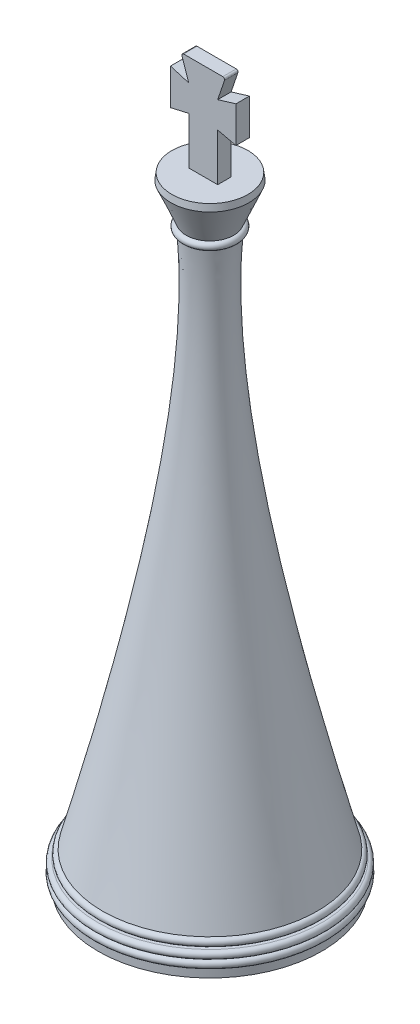
ISO-10303-21;
HEADER;
FILE_DESCRIPTION(('STEP AP214'),'2;1');
FILE_NAME('part.step','',(''),(''),'','','');
FILE_SCHEMA(('AUTOMOTIVE_DESIGN { 1 0 10303 214 1 1 1 1 }'));
ENDSEC;
DATA;
#1=APPLICATION_CONTEXT('core data for automotive mechanical design processes');
#2=APPLICATION_PROTOCOL_DEFINITION('international standard','automotive_design',2000,#1);
#3=PRODUCT_CONTEXT('',#1,'mechanical');
#4=PRODUCT('Part','Part','',(#3));
#5=PRODUCT_RELATED_PRODUCT_CATEGORY('part','',(#4));
#6=PRODUCT_DEFINITION_FORMATION('','',#4);
#7=PRODUCT_DEFINITION_CONTEXT('part definition',#1,'design');
#8=PRODUCT_DEFINITION('design','',#6,#7);
#9=PRODUCT_DEFINITION_SHAPE('','',#8);
#10=(LENGTH_UNIT() NAMED_UNIT(*) SI_UNIT(.MILLI.,.METRE.));
#11=(NAMED_UNIT(*) PLANE_ANGLE_UNIT() SI_UNIT($,.RADIAN.));
#12=(NAMED_UNIT(*) SI_UNIT($,.STERADIAN.) SOLID_ANGLE_UNIT());
#13=UNCERTAINTY_MEASURE_WITH_UNIT(LENGTH_MEASURE(1.E-05),#10,'distance_accuracy_value','');
#14=(GEOMETRIC_REPRESENTATION_CONTEXT(3) GLOBAL_UNCERTAINTY_ASSIGNED_CONTEXT((#13)) GLOBAL_UNIT_ASSIGNED_CONTEXT((#10,
#11,#12)) REPRESENTATION_CONTEXT('',''));
#15=CARTESIAN_POINT('',(0.,0.,0.));
#16=DIRECTION('',(0.,0.,1.));
#17=DIRECTION('',(1.,0.,0.));
#18=AXIS2_PLACEMENT_3D('',#15,#16,#17);
#19=CARTESIAN_POINT('',(0.,69.0986466795148,0.));
#20=DIRECTION('',(0.,1.,0.));
#21=DIRECTION('',(-1.,0.,0.));
#22=AXIS2_PLACEMENT_3D('',#19,#20,#21);
#23=PLANE('',#22);
#24=CARTESIAN_POINT('',(0.,69.0986466795148,0.));
#25=DIRECTION('',(0.,1.,0.));
#26=DIRECTION('',(-1.,0.,0.));
#27=AXIS2_PLACEMENT_3D('',#24,#25,#26);
#28=CIRCLE('',#27,4.25282971060416);
#29=CARTESIAN_POINT('',(-4.25282971060424,69.0986466795148,0.));
#30=VERTEX_POINT('',#29);
#31=EDGE_CURVE('E335',#30,#30,#28,.T.);
#32=ORIENTED_EDGE('',*,*,#31,.T.);
#33=EDGE_LOOP('',(#32));
#34=FACE_BOUND('',#33,.T.);
#35=DIRECTION('',(0.,0.,1.));
#36=VECTOR('',#35,1.);
#37=CARTESIAN_POINT('',(-1.61569162551264,69.0986466795148,-0.75));
#38=LINE('',#37,#36);
#39=CARTESIAN_POINT('',(-1.61569162551264,69.0986466795148,-0.75));
#40=VERTEX_POINT('',#39);
#41=CARTESIAN_POINT('',(-1.61569162551264,69.0986466795148,0.75));
#42=VERTEX_POINT('',#41);
#43=EDGE_CURVE('E170',#40,#42,#38,.T.);
#44=ORIENTED_EDGE('',*,*,#43,.F.);
#45=DIRECTION('',(1.,0.,0.));
#46=VECTOR('',#45,1.);
#47=CARTESIAN_POINT('',(0.,69.0986466795148,-0.75));
#48=LINE('',#47,#46);
#49=CARTESIAN_POINT('',(1.61569162551264,69.0986466795148,-0.75));
#50=VERTEX_POINT('',#49);
#51=EDGE_CURVE('E155',#40,#50,#48,.T.);
#52=ORIENTED_EDGE('',*,*,#51,.T.);
#53=DIRECTION('',(0.,0.,-1.));
#54=VECTOR('',#53,1.);
#55=CARTESIAN_POINT('',(1.61569162551264,69.0986466795148,0.75));
#56=LINE('',#55,#54);
#57=CARTESIAN_POINT('',(1.61569162551264,69.0986466795148,0.75));
#58=VERTEX_POINT('',#57);
#59=EDGE_CURVE('E332',#58,#50,#56,.T.);
#60=ORIENTED_EDGE('',*,*,#59,.F.);
#61=DIRECTION('',(1.,0.,0.));
#62=VECTOR('',#61,1.);
#63=CARTESIAN_POINT('',(0.,69.0986466795148,0.75));
#64=LINE('',#63,#62);
#65=EDGE_CURVE('E244',#42,#58,#64,.T.);
#66=ORIENTED_EDGE('',*,*,#65,.F.);
#67=EDGE_LOOP('',(#44,#52,#60,#66));
#68=FACE_BOUND('',#67,.T.);
#69=ADVANCED_FACE('F43',(#34,#68),#23,.T.);
#70=CARTESIAN_POINT('',(0.,1.,0.));
#71=DIRECTION('',(0.,-1.,0.));
#72=DIRECTION('',(0.,0.,-1.));
#73=AXIS2_PLACEMENT_3D('',#70,#71,#72);
#74=CYLINDRICAL_SURFACE('',#73,12.5);
#75=CARTESIAN_POINT('',(0.,1.,0.));
#76=DIRECTION('',(0.,1.,0.));
#77=DIRECTION('',(0.,0.,1.));
#78=AXIS2_PLACEMENT_3D('',#75,#76,#77);
#79=CIRCLE('',#78,12.5);
#80=CARTESIAN_POINT('',(0.,1.,12.5));
#81=VERTEX_POINT('',#80);
#82=EDGE_CURVE('E446',#81,#81,#79,.T.);
#83=ORIENTED_EDGE('',*,*,#82,.F.);
#84=EDGE_LOOP('',(#83));
#85=FACE_BOUND('',#84,.T.);
#86=CARTESIAN_POINT('',(0.,0.,0.));
#87=DIRECTION('',(0.,1.,0.));
#88=DIRECTION('',(0.,0.,1.));
#89=AXIS2_PLACEMENT_3D('',#86,#87,#88);
#90=CIRCLE('',#89,12.5);
#91=CARTESIAN_POINT('',(0.,0.,12.5));
#92=VERTEX_POINT('',#91);
#93=EDGE_CURVE('E445',#92,#92,#90,.T.);
#94=ORIENTED_EDGE('',*,*,#93,.T.);
#95=EDGE_LOOP('',(#94));
#96=FACE_BOUND('',#95,.T.);
#97=ADVANCED_FACE('F383',(#85,#96),#74,.T.);
#98=CARTESIAN_POINT('',(0.,0.,0.));
#99=DIRECTION('',(0.,1.,0.));
#100=DIRECTION('',(0.,0.,1.));
#101=AXIS2_PLACEMENT_3D('',#98,#99,#100);
#102=PLANE('',#101);
#103=ORIENTED_EDGE('',*,*,#93,.F.);
#104=EDGE_LOOP('',(#103));
#105=FACE_BOUND('',#104,.T.);
#106=ADVANCED_FACE('F379',(#105),#102,.F.);
#107=CARTESIAN_POINT('',(0.,1.45229385849321,0.));
#108=DIRECTION('',(0.,1.,0.));
#109=DIRECTION('',(0.,0.,1.));
#110=AXIS2_PLACEMENT_3D('',#107,#108,#109);
#111=TOROIDAL_SURFACE('',#110,12.5,0.452293858493208);
#112=CARTESIAN_POINT('',(0.,1.90458771698642,0.));
#113=DIRECTION('',(0.,1.,0.));
#114=DIRECTION('',(0.,0.,1.));
#115=AXIS2_PLACEMENT_3D('',#112,#113,#114);
#116=CIRCLE('',#115,12.5);
#117=CARTESIAN_POINT('',(0.,1.90458771698642,12.5));
#118=VERTEX_POINT('',#117);
#119=EDGE_CURVE('E441',#118,#118,#116,.T.);
#120=ORIENTED_EDGE('',*,*,#119,.F.);
#121=EDGE_LOOP('',(#120));
#122=FACE_BOUND('',#121,.T.);
#123=ORIENTED_EDGE('',*,*,#82,.T.);
#124=EDGE_LOOP('',(#123));
#125=FACE_BOUND('',#124,.T.);
#126=ADVANCED_FACE('F375',(#122,#125),#111,.T.);
#127=CARTESIAN_POINT('',(0.,2.33568752677423,0.));
#128=DIRECTION('',(0.,1.,0.));
#129=DIRECTION('',(0.,0.,1.));
#130=AXIS2_PLACEMENT_3D('',#127,#128,#129);
#131=TOROIDAL_SURFACE('',#130,12.5,0.431099809787815);
#132=CARTESIAN_POINT('',(0.,2.76678733656205,0.));
#133=DIRECTION('',(0.,1.,0.));
#134=DIRECTION('',(0.,0.,1.));
#135=AXIS2_PLACEMENT_3D('',#132,#133,#134);
#136=CIRCLE('',#135,12.5);
#137=CARTESIAN_POINT('',(0.,2.76678733656205,12.5));
#138=VERTEX_POINT('',#137);
#139=EDGE_CURVE('E435',#138,#138,#136,.T.);
#140=ORIENTED_EDGE('',*,*,#139,.F.);
#141=EDGE_LOOP('',(#140));
#142=FACE_BOUND('',#141,.T.);
#143=ORIENTED_EDGE('',*,*,#119,.T.);
#144=EDGE_LOOP('',(#143));
#145=FACE_BOUND('',#144,.T.);
#146=ADVANCED_FACE('F371',(#142,#145),#131,.T.);
#147=CARTESIAN_POINT('',(12.5,2.76678733656014,0.));
#148=DIRECTION('',(0.,-1.,0.));
#149=DIRECTION('',(0.,0.,-1.));
#150=AXIS2_PLACEMENT_3D('',#147,#148,#149);
#151=PLANE('',#150);
#152=CARTESIAN_POINT('',(0.,2.76678733656205,0.));
#153=DIRECTION('',(0.,1.,0.));
#154=DIRECTION('',(0.,0.,1.));
#155=AXIS2_PLACEMENT_3D('',#152,#153,#154);
#156=CIRCLE('',#155,12.);
#157=CARTESIAN_POINT('',(0.,2.76678733656205,12.));
#158=VERTEX_POINT('',#157);
#159=EDGE_CURVE('E430',#158,#158,#156,.T.);
#160=ORIENTED_EDGE('',*,*,#159,.F.);
#161=EDGE_LOOP('',(#160));
#162=FACE_BOUND('',#161,.T.);
#163=ORIENTED_EDGE('',*,*,#139,.T.);
#164=EDGE_LOOP('',(#163));
#165=FACE_BOUND('',#164,.T.);
#166=ADVANCED_FACE('F367',(#162,#165),#151,.F.);
#167=CARTESIAN_POINT('',(0.,3.20041535418516,0.));
#168=DIRECTION('',(0.,1.,0.));
#169=DIRECTION('',(0.,0.,1.));
#170=AXIS2_PLACEMENT_3D('',#167,#168,#169);
#171=TOROIDAL_SURFACE('',#170,12.,0.433628017623108);
#172=CARTESIAN_POINT('',(0.,3.63404337180827,0.));
#173=DIRECTION('',(0.,1.,0.));
#174=DIRECTION('',(0.,0.,1.));
#175=AXIS2_PLACEMENT_3D('',#172,#173,#174);
#176=CIRCLE('',#175,12.);
#177=CARTESIAN_POINT('',(0.,3.63404337180827,12.));
#178=VERTEX_POINT('',#177);
#179=EDGE_CURVE('E427',#178,#178,#176,.T.);
#180=ORIENTED_EDGE('',*,*,#179,.F.);
#181=EDGE_LOOP('',(#180));
#182=FACE_BOUND('',#181,.T.);
#183=ORIENTED_EDGE('',*,*,#159,.T.);
#184=EDGE_LOOP('',(#183));
#185=FACE_BOUND('',#184,.T.);
#186=ADVANCED_FACE('F362',(#182,#185),#171,.T.);
#187=CARTESIAN_POINT('',(12.,3.63404337180827,0.));
#188=CARTESIAN_POINT('',(0.989364930611136,44.9146061051771,0.));
#189=CARTESIAN_POINT('',(2.66033607179249,63.5041600508196,0.));
#190=B_SPLINE_CURVE_WITH_KNOTS('',2,(#187,#188,#189),.UNSPECIFIED.,.F.,.F.,(3,3),(0.,1.),.UNSPECIFIED.);
#191=CARTESIAN_POINT('',(0.,63.5041600508228,0.));
#192=DIRECTION('',(0.,1.,0.));
#193=AXIS1_PLACEMENT('',#191,#192);
#194=SURFACE_OF_REVOLUTION('',#190,#193);
#195=CARTESIAN_POINT('',(0.,63.5041600508196,0.));
#196=DIRECTION('',(0.,1.,0.));
#197=DIRECTION('',(0.,0.,1.));
#198=AXIS2_PLACEMENT_3D('',#195,#196,#197);
#199=CIRCLE('',#198,2.66033607179249);
#200=CARTESIAN_POINT('',(0.,63.5041600508196,2.66033607179249));
#201=VERTEX_POINT('',#200);
#202=EDGE_CURVE('E347',#201,#201,#199,.T.);
#203=ORIENTED_EDGE('',*,*,#202,.F.);
#204=EDGE_LOOP('',(#203));
#205=FACE_BOUND('',#204,.T.);
#206=ORIENTED_EDGE('',*,*,#179,.T.);
#207=EDGE_LOOP('',(#206));
#208=FACE_BOUND('',#207,.T.);
#209=ADVANCED_FACE('F357',(#205,#208),#194,.T.);
#210=CARTESIAN_POINT('',(0.,63.9264033651664,0.));
#211=DIRECTION('',(0.,1.,0.));
#212=DIRECTION('',(-1.,0.,0.));
#213=AXIS2_PLACEMENT_3D('',#210,#211,#212);
#214=TOROIDAL_SURFACE('',#213,2.66033607179249,0.422243314346794);
#215=CARTESIAN_POINT('',(0.,64.3486466795132,0.));
#216=DIRECTION('',(0.,1.,0.));
#217=DIRECTION('',(-1.,0.,0.));
#218=AXIS2_PLACEMENT_3D('',#215,#216,#217);
#219=CIRCLE('',#218,2.66033607179248);
#220=CARTESIAN_POINT('',(-2.66033607179248,64.3486466795132,0.));
#221=VERTEX_POINT('',#220);
#222=EDGE_CURVE('E343',#221,#221,#219,.T.);
#223=ORIENTED_EDGE('',*,*,#222,.F.);
#224=EDGE_LOOP('',(#223));
#225=FACE_BOUND('',#224,.T.);
#226=ORIENTED_EDGE('',*,*,#202,.T.);
#227=EDGE_LOOP('',(#226));
#228=FACE_BOUND('',#227,.T.);
#229=ADVANCED_FACE('F361',(#225,#228),#214,.T.);
#230=CARTESIAN_POINT('',(0.,64.3486466795148,0.));
#231=DIRECTION('',(0.,1.,0.));
#232=DIRECTION('',(-1.,0.,0.));
#233=AXIS2_PLACEMENT_3D('',#230,#231,#232);
#234=CONICAL_SURFACE('',#233,2.66033607179254,0.401425727958696);
#235=CARTESIAN_POINT('',(0.,68.3486466795148,0.));
#236=DIRECTION('',(0.,1.,0.));
#237=DIRECTION('',(-1.,0.,0.));
#238=AXIS2_PLACEMENT_3D('',#235,#236,#237);
#239=CIRCLE('',#238,4.35823533663096);
#240=CARTESIAN_POINT('',(-4.35823533663103,68.3486466795148,0.));
#241=VERTEX_POINT('',#240);
#242=EDGE_CURVE('E339',#241,#241,#239,.T.);
#243=ORIENTED_EDGE('',*,*,#242,.F.);
#244=EDGE_LOOP('',(#243));
#245=FACE_BOUND('',#244,.T.);
#246=ORIENTED_EDGE('',*,*,#222,.T.);
#247=EDGE_LOOP('',(#246));
#248=FACE_BOUND('',#247,.T.);
#249=ADVANCED_FACE('F412',(#245,#248),#234,.T.);
#250=CARTESIAN_POINT('',(0.,68.3486466795148,0.));
#251=DIRECTION('',(0.,-1.,0.));
#252=DIRECTION('',(-1.,0.,0.));
#253=AXIS2_PLACEMENT_3D('',#250,#251,#252);
#254=CONICAL_SURFACE('',#253,4.35823533663096,0.139626340159546);
#255=ORIENTED_EDGE('',*,*,#31,.F.);
#256=EDGE_LOOP('',(#255));
#257=FACE_BOUND('',#256,.T.);
#258=ORIENTED_EDGE('',*,*,#242,.T.);
#259=EDGE_LOOP('',(#258));
#260=FACE_BOUND('',#259,.T.);
#261=ADVANCED_FACE('F410',(#257,#260),#254,.T.);
#262=CARTESIAN_POINT('',(1.61569162551264,69.0986466795148,0.75));
#263=DIRECTION('',(-1.,0.,0.));
#264=DIRECTION('',(0.,0.,1.));
#265=AXIS2_PLACEMENT_3D('',#262,#263,#264);
#266=PLANE('',#265);
#267=DIRECTION('',(0.,1.,0.));
#268=VECTOR('',#267,1.);
#269=CARTESIAN_POINT('',(1.61569162551264,69.0986466795148,-0.75));
#270=LINE('',#269,#268);
#271=CARTESIAN_POINT('',(1.61569162551264,74.385715226086,-0.75));
#272=VERTEX_POINT('',#271);
#273=EDGE_CURVE('E284',#50,#272,#270,.T.);
#274=ORIENTED_EDGE('',*,*,#273,.T.);
#275=DIRECTION('',(0.,0.,-1.));
#276=VECTOR('',#275,1.);
#277=CARTESIAN_POINT('',(1.61569162551264,74.385715226086,0.75));
#278=LINE('',#277,#276);
#279=CARTESIAN_POINT('',(1.61569162551264,74.385715226086,0.75));
#280=VERTEX_POINT('',#279);
#281=EDGE_CURVE('E328',#280,#272,#278,.T.);
#282=ORIENTED_EDGE('',*,*,#281,.F.);
#283=DIRECTION('',(0.,1.,0.));
#284=VECTOR('',#283,1.);
#285=CARTESIAN_POINT('',(1.61569162551264,69.0986466795148,0.75));
#286=LINE('',#285,#284);
#287=EDGE_CURVE('E247',#58,#280,#286,.T.);
#288=ORIENTED_EDGE('',*,*,#287,.F.);
#289=ORIENTED_EDGE('',*,*,#59,.T.);
#290=EDGE_LOOP('',(#274,#282,#288,#289));
#291=FACE_BOUND('',#290,.T.);
#292=ADVANCED_FACE('F408',(#291),#266,.F.);
#293=CARTESIAN_POINT('',(1.61569162551264,74.385715226086,0.75));
#294=DIRECTION('',(0.226513494660276,0.974008027039197,0.));
#295=DIRECTION('',(-0.974008027039197,0.226513494660276,0.));
#296=AXIS2_PLACEMENT_3D('',#293,#294,#295);
#297=PLANE('',#296);
#298=CARTESIAN_POINT('',(1.61569162551264,74.385715226086,-0.75));
#299=CARTESIAN_POINT('',(3.65499817713058,73.9114578885005,-0.75));
#300=B_SPLINE_CURVE_WITH_KNOTS('',1,(#298,#299),.UNSPECIFIED.,.F.,.F.,(2,2),(0.,1.),.UNSPECIFIED.);
#301=CARTESIAN_POINT('',(3.65499817713058,73.9114578885005,-0.75));
#302=VERTEX_POINT('',#301);
#303=EDGE_CURVE('E287',#272,#302,#300,.T.);
#304=ORIENTED_EDGE('',*,*,#303,.T.);
#305=DIRECTION('',(0.,0.,-1.));
#306=VECTOR('',#305,1.);
#307=CARTESIAN_POINT('',(3.65499817713058,73.9114578885005,0.75));
#308=LINE('',#307,#306);
#309=CARTESIAN_POINT('',(3.65499817713058,73.9114578885005,0.75));
#310=VERTEX_POINT('',#309);
#311=EDGE_CURVE('E324',#310,#302,#308,.T.);
#312=ORIENTED_EDGE('',*,*,#311,.F.);
#313=CARTESIAN_POINT('',(1.61569162551264,74.385715226086,0.75));
#314=CARTESIAN_POINT('',(3.65499817713058,73.9114578885005,0.75));
#315=B_SPLINE_CURVE_WITH_KNOTS('',1,(#313,#314),.UNSPECIFIED.,.F.,.F.,(2,2),(0.,1.),.UNSPECIFIED.);
#316=EDGE_CURVE('E251',#280,#310,#315,.T.);
#317=ORIENTED_EDGE('',*,*,#316,.F.);
#318=ORIENTED_EDGE('',*,*,#281,.T.);
#319=EDGE_LOOP('',(#304,#312,#317,#318));
#320=FACE_BOUND('',#319,.T.);
#321=ADVANCED_FACE('F493',(#320),#297,.F.);
#322=CARTESIAN_POINT('',(3.65499817713058,73.9114578885005,0.75));
#323=DIRECTION('',(-1.,0.,0.));
#324=DIRECTION('',(0.,0.,1.));
#325=AXIS2_PLACEMENT_3D('',#322,#323,#324);
#326=PLANE('',#325);
#327=DIRECTION('',(0.,1.,0.));
#328=VECTOR('',#327,1.);
#329=CARTESIAN_POINT('',(3.65499817713058,73.9114578885005,-0.75));
#330=LINE('',#329,#328);
#331=CARTESIAN_POINT('',(3.65499817713058,77.9426452579778,-0.75));
#332=VERTEX_POINT('',#331);
#333=EDGE_CURVE('E292',#302,#332,#330,.T.);
#334=ORIENTED_EDGE('',*,*,#333,.T.);
#335=DIRECTION('',(0.,0.,-1.));
#336=VECTOR('',#335,1.);
#337=CARTESIAN_POINT('',(3.65499817713058,77.9426452579778,0.75));
#338=LINE('',#337,#336);
#339=CARTESIAN_POINT('',(3.65499817713058,77.9426452579778,0.75));
#340=VERTEX_POINT('',#339);
#341=EDGE_CURVE('E320',#340,#332,#338,.T.);
#342=ORIENTED_EDGE('',*,*,#341,.F.);
#343=DIRECTION('',(0.,1.,0.));
#344=VECTOR('',#343,1.);
#345=CARTESIAN_POINT('',(3.65499817713058,73.9114578885005,0.75));
#346=LINE('',#345,#344);
#347=EDGE_CURVE('E256',#310,#340,#346,.T.);
#348=ORIENTED_EDGE('',*,*,#347,.F.);
#349=ORIENTED_EDGE('',*,*,#311,.T.);
#350=EDGE_LOOP('',(#334,#342,#348,#349));
#351=FACE_BOUND('',#350,.T.);
#352=ADVANCED_FACE('F488',(#351),#326,.F.);
#353=CARTESIAN_POINT('',(3.65499817713058,77.9426452579778,0.75));
#354=DIRECTION('',(0.289389501276322,-0.95721142729861,0.));
#355=DIRECTION('',(0.95721142729861,0.289389501276322,0.));
#356=AXIS2_PLACEMENT_3D('',#353,#354,#355);
#357=PLANE('',#356);
#358=CARTESIAN_POINT('',(3.65499817713058,77.9426452579778,-0.75));
#359=CARTESIAN_POINT('',(1.61569162551264,77.3261107191165,-0.75));
#360=B_SPLINE_CURVE_WITH_KNOTS('',1,(#358,#359),.UNSPECIFIED.,.F.,.F.,(2,2),(0.,1.),.UNSPECIFIED.);
#361=CARTESIAN_POINT('',(1.61569162551264,77.3261107191165,-0.75));
#362=VERTEX_POINT('',#361);
#363=EDGE_CURVE('E298',#332,#362,#360,.T.);
#364=ORIENTED_EDGE('',*,*,#363,.T.);
#365=DIRECTION('',(0.,0.,-1.));
#366=VECTOR('',#365,1.);
#367=CARTESIAN_POINT('',(1.61569162551264,77.3261107191165,0.75));
#368=LINE('',#367,#366);
#369=CARTESIAN_POINT('',(1.61569162551264,77.3261107191165,0.75));
#370=VERTEX_POINT('',#369);
#371=EDGE_CURVE('E281',#370,#362,#368,.T.);
#372=ORIENTED_EDGE('',*,*,#371,.F.);
#373=CARTESIAN_POINT('',(3.65499817713058,77.9426452579778,0.75));
#374=CARTESIAN_POINT('',(1.61569162551264,77.3261107191165,0.75));
#375=B_SPLINE_CURVE_WITH_KNOTS('',1,(#373,#374),.UNSPECIFIED.,.F.,.F.,(2,2),(0.,1.),.UNSPECIFIED.);
#376=EDGE_CURVE('E262',#340,#370,#375,.T.);
#377=ORIENTED_EDGE('',*,*,#376,.F.);
#378=ORIENTED_EDGE('',*,*,#341,.T.);
#379=EDGE_LOOP('',(#364,#372,#377,#378));
#380=FACE_BOUND('',#379,.T.);
#381=ADVANCED_FACE('F483',(#380),#357,.F.);
#382=CARTESIAN_POINT('',(1.61569162551264,77.3261107191165,0.75));
#383=DIRECTION('',(-0.946881588720454,0.321582426357892,0.));
#384=DIRECTION('',(-0.321582426357892,-0.946881588720454,0.));
#385=AXIS2_PLACEMENT_3D('',#382,#383,#384);
#386=PLANE('',#385);
#387=CARTESIAN_POINT('',(1.61569162551264,77.3261107191165,-0.75));
#388=CARTESIAN_POINT('',(2.46935483316666,79.83967460832,-0.75));
#389=B_SPLINE_CURVE_WITH_KNOTS('',1,(#387,#388),.UNSPECIFIED.,.F.,.F.,(2,2),(0.,1.),.UNSPECIFIED.);
#390=CARTESIAN_POINT('',(2.37958697024401,79.5753581230478,-0.75));
#391=VERTEX_POINT('',#390);
#392=EDGE_CURVE('E303',#362,#391,#389,.T.);
#393=ORIENTED_EDGE('',*,*,#392,.T.);
#394=DIRECTION('',(0.,0.,-1.));
#395=VECTOR('',#394,1.);
#396=CARTESIAN_POINT('',(2.37958697024401,79.5753581230478,0.75));
#397=LINE('',#396,#395);
#398=CARTESIAN_POINT('',(2.37958697024401,79.5753581230478,0.75));
#399=VERTEX_POINT('',#398);
#400=EDGE_CURVE('E67',#391,#399,#397,.F.);
#401=ORIENTED_EDGE('',*,*,#400,.T.);
#402=CARTESIAN_POINT('',(1.61569162551264,77.3261107191165,0.75));
#403=CARTESIAN_POINT('',(2.46935483316666,79.83967460832,0.75));
#404=B_SPLINE_CURVE_WITH_KNOTS('',1,(#402,#403),.UNSPECIFIED.,.F.,.F.,(2,2),(0.,1.),.UNSPECIFIED.);
#405=EDGE_CURVE('E267',#370,#399,#404,.T.);
#406=ORIENTED_EDGE('',*,*,#405,.F.);
#407=ORIENTED_EDGE('',*,*,#371,.T.);
#408=EDGE_LOOP('',(#393,#401,#406,#407));
#409=FACE_BOUND('',#408,.T.);
#410=ADVANCED_FACE('F479',(#409),#386,.F.);
#411=CARTESIAN_POINT('',(2.46935483316666,79.83967460832,0.75));
#412=DIRECTION('',(2.32668228772427E-12,-1.,0.));
#413=DIRECTION('',(1.,2.32668228772427E-12,0.));
#414=AXIS2_PLACEMENT_3D('',#411,#412,#413);
#415=PLANE('',#414);
#416=DIRECTION('',(-1.,-2.32668228772427E-12,0.));
#417=VECTOR('',#416,1.);
#418=CARTESIAN_POINT('',(2.46935483316666,79.83967460832,0.75));
#419=LINE('',#418,#417);
#420=CARTESIAN_POINT('',(2.19021065249946,79.8396746083194,0.75));
#421=VERTEX_POINT('',#420);
#422=CARTESIAN_POINT('',(-2.19021065249693,79.8396746083092,0.75));
#423=VERTEX_POINT('',#422);
#424=EDGE_CURVE('E275',#421,#423,#419,.T.);
#425=ORIENTED_EDGE('',*,*,#424,.F.);
#426=DIRECTION('',(0.,0.,-1.));
#427=VECTOR('',#426,1.);
#428=CARTESIAN_POINT('',(2.19021065249946,79.8396746083194,0.75));
#429=LINE('',#428,#427);
#430=CARTESIAN_POINT('',(2.19021065249946,79.8396746083194,-0.75));
#431=VERTEX_POINT('',#430);
#432=EDGE_CURVE('E457',#421,#431,#429,.T.);
#433=ORIENTED_EDGE('',*,*,#432,.T.);
#434=DIRECTION('',(-1.,-2.32668228772427E-12,0.));
#435=VECTOR('',#434,1.);
#436=CARTESIAN_POINT('',(2.46935483316666,79.83967460832,-0.75));
#437=LINE('',#436,#435);
#438=CARTESIAN_POINT('',(-2.19021065249693,79.8396746083092,-0.75));
#439=VERTEX_POINT('',#438);
#440=EDGE_CURVE('E248',#431,#439,#437,.T.);
#441=ORIENTED_EDGE('',*,*,#440,.T.);
#442=DIRECTION('',(0.,0.,1.));
#443=VECTOR('',#442,1.);
#444=CARTESIAN_POINT('',(-2.19021065249693,79.8396746083092,0.75));
#445=LINE('',#444,#443);
#446=EDGE_CURVE('E450',#439,#423,#445,.T.);
#447=ORIENTED_EDGE('',*,*,#446,.T.);
#448=EDGE_LOOP('',(#425,#433,#441,#447));
#449=FACE_BOUND('',#448,.T.);
#450=ADVANCED_FACE('F475',(#449),#415,.F.);
#451=CARTESIAN_POINT('',(0.,79.8396746083143,0.75));
#452=DIRECTION('',(0.,0.,-1.));
#453=DIRECTION('',(-1.,0.,0.));
#454=AXIS2_PLACEMENT_3D('',#451,#452,#453);
#455=PLANE('',#454);
#456=ORIENTED_EDGE('',*,*,#405,.T.);
#457=CARTESIAN_POINT('',(2.19021065249992,79.6396746083194,0.75));
#458=DIRECTION('',(0.,0.,-1.));
#459=DIRECTION('',(-1.,0.,0.));
#460=AXIS2_PLACEMENT_3D('',#457,#458,#459);
#461=CIRCLE('',#460,0.2);
#462=EDGE_CURVE('E52',#399,#421,#461,.F.);
#463=ORIENTED_EDGE('',*,*,#462,.T.);
#464=ORIENTED_EDGE('',*,*,#424,.T.);
#465=CARTESIAN_POINT('',(-2.19021065249646,79.6396746083092,0.75));
#466=DIRECTION('',(0.,0.,-1.));
#467=DIRECTION('',(-1.,0.,0.));
#468=AXIS2_PLACEMENT_3D('',#465,#466,#467);
#469=CIRCLE('',#468,0.2);
#470=CARTESIAN_POINT('',(-2.37958697024055,79.5753581230376,0.75));
#471=VERTEX_POINT('',#470);
#472=EDGE_CURVE('E59',#423,#471,#469,.F.);
#473=ORIENTED_EDGE('',*,*,#472,.T.);
#474=CARTESIAN_POINT('',(-1.61569162551264,77.3261107191165,0.75));
#475=CARTESIAN_POINT('',(-2.46935483316666,79.83967460832,0.75));
#476=B_SPLINE_CURVE_WITH_KNOTS('',1,(#474,#475),.UNSPECIFIED.,.F.,.F.,(2,2),(0.,1.),.UNSPECIFIED.);
#477=CARTESIAN_POINT('',(-1.61569162551264,77.3261107191165,0.75));
#478=VERTEX_POINT('',#477);
#479=EDGE_CURVE('E160',#478,#471,#476,.T.);
#480=ORIENTED_EDGE('',*,*,#479,.F.);
#481=CARTESIAN_POINT('',(-3.65499817713058,77.9426452579778,0.75));
#482=CARTESIAN_POINT('',(-1.61569162551264,77.3261107191165,0.75));
#483=B_SPLINE_CURVE_WITH_KNOTS('',1,(#481,#482),.UNSPECIFIED.,.F.,.F.,(2,2),(0.,1.),.UNSPECIFIED.);
#484=CARTESIAN_POINT('',(-3.65499817713058,77.9426452579778,0.75));
#485=VERTEX_POINT('',#484);
#486=EDGE_CURVE('E218',#485,#478,#483,.T.);
#487=ORIENTED_EDGE('',*,*,#486,.F.);
#488=DIRECTION('',(0.,1.,0.));
#489=VECTOR('',#488,1.);
#490=CARTESIAN_POINT('',(-3.65499817713058,73.9114578885005,0.75));
#491=LINE('',#490,#489);
#492=CARTESIAN_POINT('',(-3.65499817713058,73.9114578885005,0.75));
#493=VERTEX_POINT('',#492);
#494=EDGE_CURVE('E212',#493,#485,#491,.T.);
#495=ORIENTED_EDGE('',*,*,#494,.F.);
#496=CARTESIAN_POINT('',(-1.61569162551264,74.385715226086,0.75));
#497=CARTESIAN_POINT('',(-3.65499817713058,73.9114578885005,0.75));
#498=B_SPLINE_CURVE_WITH_KNOTS('',1,(#496,#497),.UNSPECIFIED.,.F.,.F.,(2,2),(0.,1.),.UNSPECIFIED.);
#499=CARTESIAN_POINT('',(-1.61569162551264,74.385715226086,0.75));
#500=VERTEX_POINT('',#499);
#501=EDGE_CURVE('E207',#500,#493,#498,.T.);
#502=ORIENTED_EDGE('',*,*,#501,.F.);
#503=DIRECTION('',(0.,1.,0.));
#504=VECTOR('',#503,1.);
#505=CARTESIAN_POINT('',(-1.61569162551264,69.0986466795148,0.75));
#506=LINE('',#505,#504);
#507=EDGE_CURVE('E166',#42,#500,#506,.T.);
#508=ORIENTED_EDGE('',*,*,#507,.F.);
#509=ORIENTED_EDGE('',*,*,#65,.T.);
#510=ORIENTED_EDGE('',*,*,#287,.T.);
#511=ORIENTED_EDGE('',*,*,#316,.T.);
#512=ORIENTED_EDGE('',*,*,#347,.T.);
#513=ORIENTED_EDGE('',*,*,#376,.T.);
#514=EDGE_LOOP('',(#456,#463,#464,#473,#480,#487,#495,#502,#508,#509,#510,#511,#512,#513));
#515=FACE_BOUND('',#514,.T.);
#516=ADVANCED_FACE('F472',(#515),#455,.F.);
#517=CARTESIAN_POINT('',(0.,79.8396746083143,-0.75));
#518=DIRECTION('',(0.,0.,-1.));
#519=DIRECTION('',(-1.,0.,0.));
#520=AXIS2_PLACEMENT_3D('',#517,#518,#519);
#521=PLANE('',#520);
#522=ORIENTED_EDGE('',*,*,#440,.F.);
#523=CARTESIAN_POINT('',(2.19021065249992,79.6396746083194,-0.75));
#524=DIRECTION('',(0.,0.,-1.));
#525=DIRECTION('',(-1.,0.,0.));
#526=AXIS2_PLACEMENT_3D('',#523,#524,#525);
#527=CIRCLE('',#526,0.2);
#528=EDGE_CURVE('E464',#431,#391,#527,.T.);
#529=ORIENTED_EDGE('',*,*,#528,.T.);
#530=ORIENTED_EDGE('',*,*,#392,.F.);
#531=ORIENTED_EDGE('',*,*,#363,.F.);
#532=ORIENTED_EDGE('',*,*,#333,.F.);
#533=ORIENTED_EDGE('',*,*,#303,.F.);
#534=ORIENTED_EDGE('',*,*,#273,.F.);
#535=ORIENTED_EDGE('',*,*,#51,.F.);
#536=DIRECTION('',(0.,1.,0.));
#537=VECTOR('',#536,1.);
#538=CARTESIAN_POINT('',(-1.61569162551264,69.0986466795148,-0.75));
#539=LINE('',#538,#537);
#540=CARTESIAN_POINT('',(-1.61569162551264,74.385715226086,-0.75));
#541=VERTEX_POINT('',#540);
#542=EDGE_CURVE('E146',#40,#541,#539,.T.);
#543=ORIENTED_EDGE('',*,*,#542,.T.);
#544=CARTESIAN_POINT('',(-1.61569162551264,74.385715226086,-0.75));
#545=CARTESIAN_POINT('',(-3.65499817713058,73.9114578885005,-0.75));
#546=B_SPLINE_CURVE_WITH_KNOTS('',1,(#544,#545),.UNSPECIFIED.,.F.,.F.,(2,2),(0.,1.),.UNSPECIFIED.);
#547=CARTESIAN_POINT('',(-3.65499817713058,73.9114578885005,-0.75));
#548=VERTEX_POINT('',#547);
#549=EDGE_CURVE('E151',#541,#548,#546,.T.);
#550=ORIENTED_EDGE('',*,*,#549,.T.);
#551=DIRECTION('',(0.,1.,0.));
#552=VECTOR('',#551,1.);
#553=CARTESIAN_POINT('',(-3.65499817713058,73.9114578885005,-0.75));
#554=LINE('',#553,#552);
#555=CARTESIAN_POINT('',(-3.65499817713058,77.9426452579778,-0.75));
#556=VERTEX_POINT('',#555);
#557=EDGE_CURVE('E177',#548,#556,#554,.T.);
#558=ORIENTED_EDGE('',*,*,#557,.T.);
#559=CARTESIAN_POINT('',(-3.65499817713058,77.9426452579778,-0.75));
#560=CARTESIAN_POINT('',(-1.61569162551264,77.3261107191165,-0.75));
#561=B_SPLINE_CURVE_WITH_KNOTS('',1,(#559,#560),.UNSPECIFIED.,.F.,.F.,(2,2),(0.,1.),.UNSPECIFIED.);
#562=CARTESIAN_POINT('',(-1.61569162551264,77.3261107191165,-0.75));
#563=VERTEX_POINT('',#562);
#564=EDGE_CURVE('E180',#556,#563,#561,.T.);
#565=ORIENTED_EDGE('',*,*,#564,.T.);
#566=CARTESIAN_POINT('',(-1.61569162551264,77.3261107191165,-0.75));
#567=CARTESIAN_POINT('',(-2.46935483316666,79.83967460832,-0.75));
#568=B_SPLINE_CURVE_WITH_KNOTS('',1,(#566,#567),.UNSPECIFIED.,.F.,.F.,(2,2),(0.,1.),.UNSPECIFIED.);
#569=CARTESIAN_POINT('',(-2.37958697024055,79.5753581230376,-0.75));
#570=VERTEX_POINT('',#569);
#571=EDGE_CURVE('E192',#563,#570,#568,.T.);
#572=ORIENTED_EDGE('',*,*,#571,.T.);
#573=CARTESIAN_POINT('',(-2.19021065249646,79.6396746083092,-0.75));
#574=DIRECTION('',(0.,0.,-1.));
#575=DIRECTION('',(-1.,0.,0.));
#576=AXIS2_PLACEMENT_3D('',#573,#574,#575);
#577=CIRCLE('',#576,0.2);
#578=EDGE_CURVE('E461',#570,#439,#577,.T.);
#579=ORIENTED_EDGE('',*,*,#578,.T.);
#580=EDGE_LOOP('',(#522,#529,#530,#531,#532,#533,#534,#535,#543,#550,#558,#565,#572,#579));
#581=FACE_BOUND('',#580,.T.);
#582=ADVANCED_FACE('F149',(#581),#521,.T.);
#583=CARTESIAN_POINT('',(-1.61569162551264,69.0986466795148,-0.75));
#584=DIRECTION('',(1.,0.,0.));
#585=DIRECTION('',(0.,0.,-1.));
#586=AXIS2_PLACEMENT_3D('',#583,#584,#585);
#587=PLANE('',#586);
#588=ORIENTED_EDGE('',*,*,#507,.T.);
#589=DIRECTION('',(0.,0.,1.));
#590=VECTOR('',#589,1.);
#591=CARTESIAN_POINT('',(-1.61569162551264,74.385715226086,-0.75));
#592=LINE('',#591,#590);
#593=EDGE_CURVE('E163',#541,#500,#592,.T.);
#594=ORIENTED_EDGE('',*,*,#593,.F.);
#595=ORIENTED_EDGE('',*,*,#542,.F.);
#596=ORIENTED_EDGE('',*,*,#43,.T.);
#597=EDGE_LOOP('',(#588,#594,#595,#596));
#598=FACE_BOUND('',#597,.T.);
#599=ADVANCED_FACE('F164',(#598),#587,.F.);
#600=CARTESIAN_POINT('',(-1.61569162551264,74.385715226086,-0.75));
#601=DIRECTION('',(-0.226513494660276,0.974008027039197,0.));
#602=DIRECTION('',(-0.974008027039197,-0.226513494660276,0.));
#603=AXIS2_PLACEMENT_3D('',#600,#601,#602);
#604=PLANE('',#603);
#605=ORIENTED_EDGE('',*,*,#501,.T.);
#606=DIRECTION('',(0.,0.,1.));
#607=VECTOR('',#606,1.);
#608=CARTESIAN_POINT('',(-3.65499817713058,73.9114578885005,-0.75));
#609=LINE('',#608,#607);
#610=EDGE_CURVE('E171',#548,#493,#609,.T.);
#611=ORIENTED_EDGE('',*,*,#610,.F.);
#612=ORIENTED_EDGE('',*,*,#549,.F.);
#613=ORIENTED_EDGE('',*,*,#593,.T.);
#614=EDGE_LOOP('',(#605,#611,#612,#613));
#615=FACE_BOUND('',#614,.T.);
#616=ADVANCED_FACE('F173',(#615),#604,.F.);
#617=CARTESIAN_POINT('',(-3.65499817713058,73.9114578885005,-0.75));
#618=DIRECTION('',(1.,0.,0.));
#619=DIRECTION('',(0.,0.,-1.));
#620=AXIS2_PLACEMENT_3D('',#617,#618,#619);
#621=PLANE('',#620);
#622=ORIENTED_EDGE('',*,*,#494,.T.);
#623=DIRECTION('',(0.,0.,1.));
#624=VECTOR('',#623,1.);
#625=CARTESIAN_POINT('',(-3.65499817713058,77.9426452579778,-0.75));
#626=LINE('',#625,#624);
#627=EDGE_CURVE('E236',#556,#485,#626,.T.);
#628=ORIENTED_EDGE('',*,*,#627,.F.);
#629=ORIENTED_EDGE('',*,*,#557,.F.);
#630=ORIENTED_EDGE('',*,*,#610,.T.);
#631=EDGE_LOOP('',(#622,#628,#629,#630));
#632=FACE_BOUND('',#631,.T.);
#633=ADVANCED_FACE('F501',(#632),#621,.F.);
#634=CARTESIAN_POINT('',(-3.65499817713058,77.9426452579778,-0.75));
#635=DIRECTION('',(-0.289389501276322,-0.95721142729861,0.));
#636=DIRECTION('',(0.95721142729861,-0.289389501276322,0.));
#637=AXIS2_PLACEMENT_3D('',#634,#635,#636);
#638=PLANE('',#637);
#639=ORIENTED_EDGE('',*,*,#486,.T.);
#640=DIRECTION('',(0.,0.,1.));
#641=VECTOR('',#640,1.);
#642=CARTESIAN_POINT('',(-1.61569162551264,77.3261107191165,-0.75));
#643=LINE('',#642,#641);
#644=EDGE_CURVE('E201',#563,#478,#643,.T.);
#645=ORIENTED_EDGE('',*,*,#644,.F.);
#646=ORIENTED_EDGE('',*,*,#564,.F.);
#647=ORIENTED_EDGE('',*,*,#627,.T.);
#648=EDGE_LOOP('',(#639,#645,#646,#647));
#649=FACE_BOUND('',#648,.T.);
#650=ADVANCED_FACE('F396',(#649),#638,.F.);
#651=CARTESIAN_POINT('',(-1.61569162551264,77.3261107191165,-0.75));
#652=DIRECTION('',(0.946881588720454,0.321582426357892,0.));
#653=DIRECTION('',(-0.321582426357892,0.946881588720454,0.));
#654=AXIS2_PLACEMENT_3D('',#651,#652,#653);
#655=PLANE('',#654);
#656=ORIENTED_EDGE('',*,*,#479,.T.);
#657=DIRECTION('',(0.,0.,1.));
#658=VECTOR('',#657,1.);
#659=CARTESIAN_POINT('',(-2.37958697024055,79.5753581230376,-0.75));
#660=LINE('',#659,#658);
#661=EDGE_CURVE('E11',#471,#570,#660,.F.);
#662=ORIENTED_EDGE('',*,*,#661,.T.);
#663=ORIENTED_EDGE('',*,*,#571,.F.);
#664=ORIENTED_EDGE('',*,*,#644,.T.);
#665=EDGE_LOOP('',(#656,#662,#663,#664));
#666=FACE_BOUND('',#665,.T.);
#667=ADVANCED_FACE('F389',(#666),#655,.F.);
#668=CARTESIAN_POINT('',(2.19021065249992,79.6396746083194,0.75));
#669=DIRECTION('',(0.,0.,-1.));
#670=DIRECTION('',(-1.,0.,0.));
#671=AXIS2_PLACEMENT_3D('',#668,#669,#670);
#672=CYLINDRICAL_SURFACE('',#671,0.2);
#673=ORIENTED_EDGE('',*,*,#462,.F.);
#674=ORIENTED_EDGE('',*,*,#400,.F.);
#675=ORIENTED_EDGE('',*,*,#528,.F.);
#676=ORIENTED_EDGE('',*,*,#432,.F.);
#677=EDGE_LOOP('',(#673,#674,#675,#676));
#678=FACE_BOUND('',#677,.T.);
#679=ADVANCED_FACE('F387',(#678),#672,.T.);
#680=CARTESIAN_POINT('',(-2.19021065249646,79.6396746083092,0.75));
#681=DIRECTION('',(0.,0.,1.));
#682=DIRECTION('',(1.,0.,0.));
#683=AXIS2_PLACEMENT_3D('',#680,#681,#682);
#684=CYLINDRICAL_SURFACE('',#683,0.2);
#685=ORIENTED_EDGE('',*,*,#578,.F.);
#686=ORIENTED_EDGE('',*,*,#661,.F.);
#687=ORIENTED_EDGE('',*,*,#472,.F.);
#688=ORIENTED_EDGE('',*,*,#446,.F.);
#689=EDGE_LOOP('',(#685,#686,#687,#688));
#690=FACE_BOUND('',#689,.T.);
#691=ADVANCED_FACE('F45',(#690),#684,.T.);
#692=CLOSED_SHELL('',(#69,#97,#106,#126,#146,#166,#186,#209,#229,#249,#261,#292,#321,#352,#381,
#410,#450,#516,#582,#599,#616,#633,#650,#667,#679,#691));
#693=MANIFOLD_SOLID_BREP('B2',#692);
#694=ADVANCED_BREP_SHAPE_REPRESENTATION('',(#18,#693),#14);
#695=SHAPE_DEFINITION_REPRESENTATION(#9,#694);
ENDSEC;
END-ISO-10303-21;
